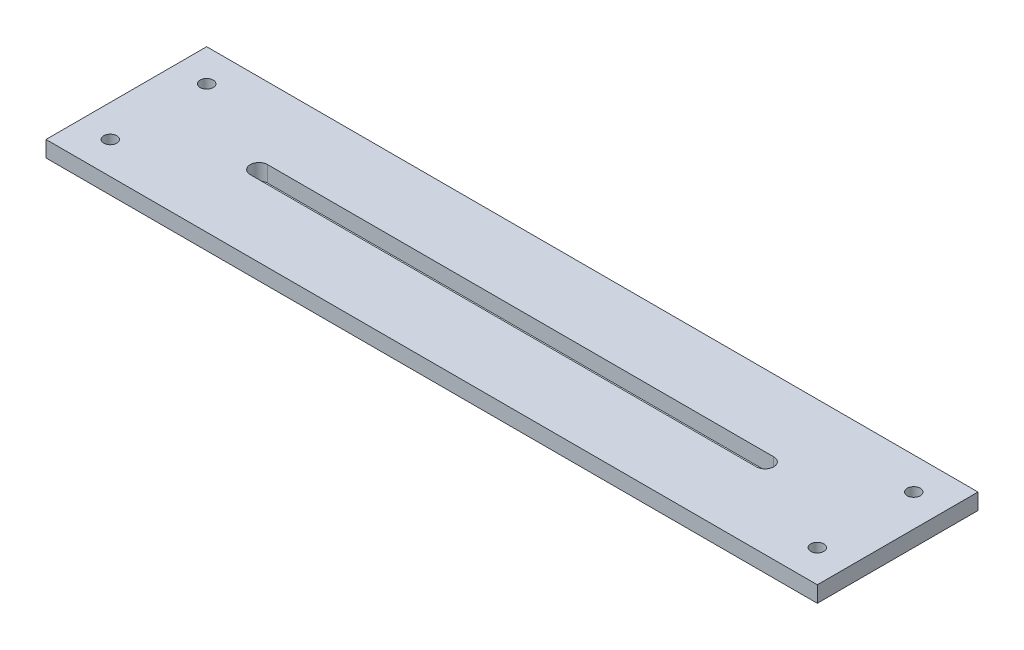
ISO-10303-21;
HEADER;
FILE_DESCRIPTION(('STEP AP214'),'2;1');
FILE_NAME('part.step','',(''),(''),'','','');
FILE_SCHEMA(('AUTOMOTIVE_DESIGN { 1 0 10303 214 1 1 1 1 }'));
ENDSEC;
DATA;
#1=APPLICATION_CONTEXT('core data for automotive mechanical design processes');
#2=APPLICATION_PROTOCOL_DEFINITION('international standard','automotive_design',2000,#1);
#3=PRODUCT_CONTEXT('',#1,'mechanical');
#4=PRODUCT('Part','Part','',(#3));
#5=PRODUCT_RELATED_PRODUCT_CATEGORY('part','',(#4));
#6=PRODUCT_DEFINITION_FORMATION('','',#4);
#7=PRODUCT_DEFINITION_CONTEXT('part definition',#1,'design');
#8=PRODUCT_DEFINITION('design','',#6,#7);
#9=PRODUCT_DEFINITION_SHAPE('','',#8);
#10=(LENGTH_UNIT() NAMED_UNIT(*) SI_UNIT(.MILLI.,.METRE.));
#11=(NAMED_UNIT(*) PLANE_ANGLE_UNIT() SI_UNIT($,.RADIAN.));
#12=(NAMED_UNIT(*) SI_UNIT($,.STERADIAN.) SOLID_ANGLE_UNIT());
#13=UNCERTAINTY_MEASURE_WITH_UNIT(LENGTH_MEASURE(1.E-05),#10,'distance_accuracy_value','');
#14=(GEOMETRIC_REPRESENTATION_CONTEXT(3) GLOBAL_UNCERTAINTY_ASSIGNED_CONTEXT((#13)) GLOBAL_UNIT_ASSIGNED_CONTEXT((#10,
#11,#12)) REPRESENTATION_CONTEXT('',''));
#15=CARTESIAN_POINT('',(0.,0.,0.));
#16=DIRECTION('',(0.,0.,1.));
#17=DIRECTION('',(1.,0.,0.));
#18=AXIS2_PLACEMENT_3D('',#15,#16,#17);
#19=CARTESIAN_POINT('',(0.,6.35,0.));
#20=DIRECTION('',(0.,-1.,0.));
#21=DIRECTION('',(0.,0.,-1.));
#22=AXIS2_PLACEMENT_3D('',#19,#20,#21);
#23=PLANE('',#22);
#24=DIRECTION('',(0.,0.,1.));
#25=VECTOR('',#24,1.);
#26=CARTESIAN_POINT('',(-152.4,6.35,-31.75));
#27=LINE('',#26,#25);
#28=CARTESIAN_POINT('',(-152.4,6.35,-31.75));
#29=VERTEX_POINT('',#28);
#30=CARTESIAN_POINT('',(-152.4,6.35,31.75));
#31=VERTEX_POINT('',#30);
#32=EDGE_CURVE('E137',#29,#31,#27,.T.);
#33=ORIENTED_EDGE('',*,*,#32,.T.);
#34=DIRECTION('',(1.,0.,0.));
#35=VECTOR('',#34,1.);
#36=CARTESIAN_POINT('',(152.4,6.35,31.75));
#37=LINE('',#36,#35);
#38=CARTESIAN_POINT('',(152.4,6.35,31.75));
#39=VERTEX_POINT('',#38);
#40=EDGE_CURVE('E140',#31,#39,#37,.T.);
#41=ORIENTED_EDGE('',*,*,#40,.T.);
#42=DIRECTION('',(0.,0.,-1.));
#43=VECTOR('',#42,1.);
#44=CARTESIAN_POINT('',(152.4,6.35,-31.75));
#45=LINE('',#44,#43);
#46=CARTESIAN_POINT('',(152.4,6.35,-31.75));
#47=VERTEX_POINT('',#46);
#48=EDGE_CURVE('E143',#39,#47,#45,.T.);
#49=ORIENTED_EDGE('',*,*,#48,.T.);
#50=DIRECTION('',(-1.,0.,0.));
#51=VECTOR('',#50,1.);
#52=CARTESIAN_POINT('',(152.4,6.35,-31.75));
#53=LINE('',#52,#51);
#54=EDGE_CURVE('E145',#47,#29,#53,.T.);
#55=ORIENTED_EDGE('',*,*,#54,.T.);
#56=EDGE_LOOP('',(#33,#41,#49,#55));
#57=FACE_BOUND('',#56,.T.);
#58=CARTESIAN_POINT('',(-100.,6.35,0.));
#59=DIRECTION('',(0.,1.,0.));
#60=DIRECTION('',(0.,0.,1.));
#61=AXIS2_PLACEMENT_3D('',#58,#59,#60);
#62=CIRCLE('',#61,3.429);
#63=CARTESIAN_POINT('',(-100.,6.35,-3.429));
#64=VERTEX_POINT('',#63);
#65=CARTESIAN_POINT('',(-100.,6.35,3.429));
#66=VERTEX_POINT('',#65);
#67=EDGE_CURVE('E98',#64,#66,#62,.T.);
#68=ORIENTED_EDGE('',*,*,#67,.F.);
#69=DIRECTION('',(-1.,0.,0.));
#70=VECTOR('',#69,1.);
#71=CARTESIAN_POINT('',(-100.,6.35,-3.429));
#72=LINE('',#71,#70);
#73=CARTESIAN_POINT('',(100.,6.35,-3.429));
#74=VERTEX_POINT('',#73);
#75=EDGE_CURVE('E121',#74,#64,#72,.T.);
#76=ORIENTED_EDGE('',*,*,#75,.F.);
#77=CARTESIAN_POINT('',(100.,6.35,0.));
#78=DIRECTION('',(0.,1.,0.));
#79=DIRECTION('',(0.,0.,1.));
#80=AXIS2_PLACEMENT_3D('',#77,#78,#79);
#81=CIRCLE('',#80,3.429);
#82=CARTESIAN_POINT('',(100.,6.35,3.42899999999996));
#83=VERTEX_POINT('',#82);
#84=EDGE_CURVE('E119',#83,#74,#81,.T.);
#85=ORIENTED_EDGE('',*,*,#84,.F.);
#86=DIRECTION('',(1.,0.,0.));
#87=VECTOR('',#86,1.);
#88=CARTESIAN_POINT('',(-100.,6.35,3.429));
#89=LINE('',#88,#87);
#90=EDGE_CURVE('E106',#66,#83,#89,.T.);
#91=ORIENTED_EDGE('',*,*,#90,.F.);
#92=EDGE_LOOP('',(#68,#76,#85,#91));
#93=FACE_BOUND('',#92,.T.);
#94=CARTESIAN_POINT('',(-139.7,6.35,-19.05));
#95=DIRECTION('',(0.,1.,0.));
#96=DIRECTION('',(0.,0.,1.));
#97=AXIS2_PLACEMENT_3D('',#94,#95,#96);
#98=CIRCLE('',#97,2.57968750000001);
#99=CARTESIAN_POINT('',(-139.7,6.35,-16.4703125));
#100=VERTEX_POINT('',#99);
#101=EDGE_CURVE('E127',#100,#100,#98,.T.);
#102=ORIENTED_EDGE('',*,*,#101,.F.);
#103=EDGE_LOOP('',(#102));
#104=FACE_BOUND('',#103,.T.);
#105=CARTESIAN_POINT('',(139.7,6.35,-19.0499999999993));
#106=DIRECTION('',(0.,1.,0.));
#107=DIRECTION('',(0.,0.,-1.));
#108=AXIS2_PLACEMENT_3D('',#105,#106,#107);
#109=CIRCLE('',#108,2.57968750000002);
#110=CARTESIAN_POINT('',(139.7,6.35,-21.6296874999993));
#111=VERTEX_POINT('',#110);
#112=EDGE_CURVE('E249',#111,#111,#109,.T.);
#113=ORIENTED_EDGE('',*,*,#112,.F.);
#114=EDGE_LOOP('',(#113));
#115=FACE_BOUND('',#114,.T.);
#116=CARTESIAN_POINT('',(139.7,6.35,19.049999999999));
#117=DIRECTION('',(0.,1.,0.));
#118=DIRECTION('',(0.,0.,1.));
#119=AXIS2_PLACEMENT_3D('',#116,#117,#118);
#120=CIRCLE('',#119,2.57968750000002);
#121=CARTESIAN_POINT('',(139.7,6.35,21.6296874999991));
#122=VERTEX_POINT('',#121);
#123=EDGE_CURVE('E243',#122,#122,#120,.T.);
#124=ORIENTED_EDGE('',*,*,#123,.F.);
#125=EDGE_LOOP('',(#124));
#126=FACE_BOUND('',#125,.T.);
#127=CARTESIAN_POINT('',(-139.7,6.35,19.05));
#128=DIRECTION('',(0.,1.,0.));
#129=DIRECTION('',(0.,0.,-1.));
#130=AXIS2_PLACEMENT_3D('',#127,#128,#129);
#131=CIRCLE('',#130,2.57968750000001);
#132=CARTESIAN_POINT('',(-139.7,6.35,16.4703125));
#133=VERTEX_POINT('',#132);
#134=EDGE_CURVE('E234',#133,#133,#131,.T.);
#135=ORIENTED_EDGE('',*,*,#134,.F.);
#136=EDGE_LOOP('',(#135));
#137=FACE_BOUND('',#136,.T.);
#138=ADVANCED_FACE('F33',(#57,#93,#104,#115,#126,#137),#23,.F.);
#139=CARTESIAN_POINT('',(0.,0.,0.));
#140=DIRECTION('',(0.,-1.,0.));
#141=DIRECTION('',(0.,0.,-1.));
#142=AXIS2_PLACEMENT_3D('',#139,#140,#141);
#143=PLANE('',#142);
#144=CARTESIAN_POINT('',(139.7,0.,19.049999999999));
#145=DIRECTION('',(0.,1.,0.));
#146=DIRECTION('',(0.,0.,1.));
#147=AXIS2_PLACEMENT_3D('',#144,#145,#146);
#148=CIRCLE('',#147,2.57968750000002);
#149=CARTESIAN_POINT('',(139.7,0.,21.6296874999991));
#150=VERTEX_POINT('',#149);
#151=EDGE_CURVE('E240',#150,#150,#148,.T.);
#152=ORIENTED_EDGE('',*,*,#151,.T.);
#153=EDGE_LOOP('',(#152));
#154=FACE_BOUND('',#153,.T.);
#155=CARTESIAN_POINT('',(-139.7,0.,-19.05));
#156=DIRECTION('',(0.,1.,0.));
#157=DIRECTION('',(0.,0.,1.));
#158=AXIS2_PLACEMENT_3D('',#155,#156,#157);
#159=CIRCLE('',#158,2.57968750000001);
#160=CARTESIAN_POINT('',(-139.7,0.,-16.4703125));
#161=VERTEX_POINT('',#160);
#162=EDGE_CURVE('E252',#161,#161,#159,.T.);
#163=ORIENTED_EDGE('',*,*,#162,.T.);
#164=EDGE_LOOP('',(#163));
#165=FACE_BOUND('',#164,.T.);
#166=DIRECTION('',(0.,0.,1.));
#167=VECTOR('',#166,1.);
#168=CARTESIAN_POINT('',(-152.4,0.,-31.75));
#169=LINE('',#168,#167);
#170=CARTESIAN_POINT('',(-152.4,0.,-31.75));
#171=VERTEX_POINT('',#170);
#172=CARTESIAN_POINT('',(-152.4,0.,31.75));
#173=VERTEX_POINT('',#172);
#174=EDGE_CURVE('E114',#171,#173,#169,.T.);
#175=ORIENTED_EDGE('',*,*,#174,.F.);
#176=DIRECTION('',(-1.,0.,0.));
#177=VECTOR('',#176,1.);
#178=CARTESIAN_POINT('',(152.4,0.,-31.75));
#179=LINE('',#178,#177);
#180=CARTESIAN_POINT('',(152.4,0.,-31.75));
#181=VERTEX_POINT('',#180);
#182=EDGE_CURVE('E141',#181,#171,#179,.T.);
#183=ORIENTED_EDGE('',*,*,#182,.F.);
#184=DIRECTION('',(0.,0.,-1.));
#185=VECTOR('',#184,1.);
#186=CARTESIAN_POINT('',(152.4,0.,-31.75));
#187=LINE('',#186,#185);
#188=CARTESIAN_POINT('',(152.4,0.,31.75));
#189=VERTEX_POINT('',#188);
#190=EDGE_CURVE('E152',#189,#181,#187,.T.);
#191=ORIENTED_EDGE('',*,*,#190,.F.);
#192=DIRECTION('',(1.,0.,0.));
#193=VECTOR('',#192,1.);
#194=CARTESIAN_POINT('',(152.4,0.,31.75));
#195=LINE('',#194,#193);
#196=EDGE_CURVE('E150',#173,#189,#195,.T.);
#197=ORIENTED_EDGE('',*,*,#196,.F.);
#198=EDGE_LOOP('',(#175,#183,#191,#197));
#199=FACE_BOUND('',#198,.T.);
#200=DIRECTION('',(-1.,0.,0.));
#201=VECTOR('',#200,1.);
#202=CARTESIAN_POINT('',(-100.,0.,-3.429));
#203=LINE('',#202,#201);
#204=CARTESIAN_POINT('',(100.,0.,-3.429));
#205=VERTEX_POINT('',#204);
#206=CARTESIAN_POINT('',(-100.,0.,-3.429));
#207=VERTEX_POINT('',#206);
#208=EDGE_CURVE('E107',#205,#207,#203,.T.);
#209=ORIENTED_EDGE('',*,*,#208,.T.);
#210=CARTESIAN_POINT('',(-100.,0.,0.));
#211=DIRECTION('',(0.,1.,0.));
#212=DIRECTION('',(0.,0.,1.));
#213=AXIS2_PLACEMENT_3D('',#210,#211,#212);
#214=CIRCLE('',#213,3.429);
#215=CARTESIAN_POINT('',(-100.,0.,3.429));
#216=VERTEX_POINT('',#215);
#217=EDGE_CURVE('E56',#207,#216,#214,.T.);
#218=ORIENTED_EDGE('',*,*,#217,.T.);
#219=DIRECTION('',(1.,0.,0.));
#220=VECTOR('',#219,1.);
#221=CARTESIAN_POINT('',(-100.,0.,3.429));
#222=LINE('',#221,#220);
#223=CARTESIAN_POINT('',(100.,0.,3.42899999999996));
#224=VERTEX_POINT('',#223);
#225=EDGE_CURVE('E113',#216,#224,#222,.T.);
#226=ORIENTED_EDGE('',*,*,#225,.T.);
#227=CARTESIAN_POINT('',(100.,0.,0.));
#228=DIRECTION('',(0.,1.,0.));
#229=DIRECTION('',(0.,0.,1.));
#230=AXIS2_PLACEMENT_3D('',#227,#228,#229);
#231=CIRCLE('',#230,3.429);
#232=EDGE_CURVE('E129',#224,#205,#231,.T.);
#233=ORIENTED_EDGE('',*,*,#232,.T.);
#234=EDGE_LOOP('',(#209,#218,#226,#233));
#235=FACE_BOUND('',#234,.T.);
#236=CARTESIAN_POINT('',(139.7,0.,-19.0499999999993));
#237=DIRECTION('',(0.,1.,0.));
#238=DIRECTION('',(0.,0.,-1.));
#239=AXIS2_PLACEMENT_3D('',#236,#237,#238);
#240=CIRCLE('',#239,2.57968750000002);
#241=CARTESIAN_POINT('',(139.7,0.,-21.6296874999993));
#242=VERTEX_POINT('',#241);
#243=EDGE_CURVE('E246',#242,#242,#240,.T.);
#244=ORIENTED_EDGE('',*,*,#243,.T.);
#245=EDGE_LOOP('',(#244));
#246=FACE_BOUND('',#245,.T.);
#247=CARTESIAN_POINT('',(-139.7,0.,19.05));
#248=DIRECTION('',(0.,1.,0.));
#249=DIRECTION('',(0.,0.,-1.));
#250=AXIS2_PLACEMENT_3D('',#247,#248,#249);
#251=CIRCLE('',#250,2.57968750000001);
#252=CARTESIAN_POINT('',(-139.7,0.,16.4703125));
#253=VERTEX_POINT('',#252);
#254=EDGE_CURVE('E237',#253,#253,#251,.T.);
#255=ORIENTED_EDGE('',*,*,#254,.T.);
#256=EDGE_LOOP('',(#255));
#257=FACE_BOUND('',#256,.T.);
#258=ADVANCED_FACE('F170',(#154,#165,#199,#235,#246,#257),#143,.T.);
#259=CARTESIAN_POINT('',(-152.4,6.35,-31.75));
#260=DIRECTION('',(1.,0.,0.));
#261=DIRECTION('',(0.,0.,-1.));
#262=AXIS2_PLACEMENT_3D('',#259,#260,#261);
#263=PLANE('',#262);
#264=ORIENTED_EDGE('',*,*,#174,.T.);
#265=DIRECTION('',(0.,-1.,0.));
#266=VECTOR('',#265,1.);
#267=CARTESIAN_POINT('',(-152.4,6.35,31.75));
#268=LINE('',#267,#266);
#269=EDGE_CURVE('E11',#31,#173,#268,.T.);
#270=ORIENTED_EDGE('',*,*,#269,.F.);
#271=ORIENTED_EDGE('',*,*,#32,.F.);
#272=DIRECTION('',(0.,-1.,0.));
#273=VECTOR('',#272,1.);
#274=CARTESIAN_POINT('',(-152.4,6.35,-31.75));
#275=LINE('',#274,#273);
#276=EDGE_CURVE('E147',#29,#171,#275,.T.);
#277=ORIENTED_EDGE('',*,*,#276,.T.);
#278=EDGE_LOOP('',(#264,#270,#271,#277));
#279=FACE_BOUND('',#278,.T.);
#280=ADVANCED_FACE('F35',(#279),#263,.F.);
#281=CARTESIAN_POINT('',(152.4,6.35,31.75));
#282=DIRECTION('',(0.,0.,-1.));
#283=DIRECTION('',(-1.,0.,0.));
#284=AXIS2_PLACEMENT_3D('',#281,#282,#283);
#285=PLANE('',#284);
#286=ORIENTED_EDGE('',*,*,#196,.T.);
#287=DIRECTION('',(0.,-1.,0.));
#288=VECTOR('',#287,1.);
#289=CARTESIAN_POINT('',(152.4,6.35,31.75));
#290=LINE('',#289,#288);
#291=EDGE_CURVE('E41',#39,#189,#290,.T.);
#292=ORIENTED_EDGE('',*,*,#291,.F.);
#293=ORIENTED_EDGE('',*,*,#40,.F.);
#294=ORIENTED_EDGE('',*,*,#269,.T.);
#295=EDGE_LOOP('',(#286,#292,#293,#294));
#296=FACE_BOUND('',#295,.T.);
#297=ADVANCED_FACE('F180',(#296),#285,.F.);
#298=CARTESIAN_POINT('',(152.4,6.35,-31.75));
#299=DIRECTION('',(-1.,0.,0.));
#300=DIRECTION('',(0.,0.,1.));
#301=AXIS2_PLACEMENT_3D('',#298,#299,#300);
#302=PLANE('',#301);
#303=ORIENTED_EDGE('',*,*,#190,.T.);
#304=DIRECTION('',(0.,-1.,0.));
#305=VECTOR('',#304,1.);
#306=CARTESIAN_POINT('',(152.4,6.35,-31.75));
#307=LINE('',#306,#305);
#308=EDGE_CURVE('E157',#47,#181,#307,.T.);
#309=ORIENTED_EDGE('',*,*,#308,.F.);
#310=ORIENTED_EDGE('',*,*,#48,.F.);
#311=ORIENTED_EDGE('',*,*,#291,.T.);
#312=EDGE_LOOP('',(#303,#309,#310,#311));
#313=FACE_BOUND('',#312,.T.);
#314=ADVANCED_FACE('F164',(#313),#302,.F.);
#315=CARTESIAN_POINT('',(152.4,6.35,-31.75));
#316=DIRECTION('',(0.,0.,1.));
#317=DIRECTION('',(1.,0.,0.));
#318=AXIS2_PLACEMENT_3D('',#315,#316,#317);
#319=PLANE('',#318);
#320=ORIENTED_EDGE('',*,*,#182,.T.);
#321=ORIENTED_EDGE('',*,*,#276,.F.);
#322=ORIENTED_EDGE('',*,*,#54,.F.);
#323=ORIENTED_EDGE('',*,*,#308,.T.);
#324=EDGE_LOOP('',(#320,#321,#322,#323));
#325=FACE_BOUND('',#324,.T.);
#326=ADVANCED_FACE('F174',(#325),#319,.F.);
#327=CARTESIAN_POINT('',(-100.,6.35,0.));
#328=DIRECTION('',(0.,-1.,0.));
#329=DIRECTION('',(0.,0.,-1.));
#330=AXIS2_PLACEMENT_3D('',#327,#328,#329);
#331=CYLINDRICAL_SURFACE('',#330,3.429);
#332=ORIENTED_EDGE('',*,*,#217,.F.);
#333=DIRECTION('',(0.,-1.,0.));
#334=VECTOR('',#333,1.);
#335=CARTESIAN_POINT('',(-100.,6.35,-3.429));
#336=LINE('',#335,#334);
#337=EDGE_CURVE('E102',#64,#207,#336,.T.);
#338=ORIENTED_EDGE('',*,*,#337,.F.);
#339=ORIENTED_EDGE('',*,*,#67,.T.);
#340=DIRECTION('',(0.,-1.,0.));
#341=VECTOR('',#340,1.);
#342=CARTESIAN_POINT('',(-100.,6.35,3.429));
#343=LINE('',#342,#341);
#344=EDGE_CURVE('E101',#66,#216,#343,.T.);
#345=ORIENTED_EDGE('',*,*,#344,.T.);
#346=EDGE_LOOP('',(#332,#338,#339,#345));
#347=FACE_BOUND('',#346,.T.);
#348=ADVANCED_FACE('F100',(#347),#331,.F.);
#349=CARTESIAN_POINT('',(-100.,6.35,3.429));
#350=DIRECTION('',(0.,0.,-1.));
#351=DIRECTION('',(-1.,0.,0.));
#352=AXIS2_PLACEMENT_3D('',#349,#350,#351);
#353=PLANE('',#352);
#354=ORIENTED_EDGE('',*,*,#225,.F.);
#355=ORIENTED_EDGE('',*,*,#344,.F.);
#356=ORIENTED_EDGE('',*,*,#90,.T.);
#357=DIRECTION('',(0.,-1.,0.));
#358=VECTOR('',#357,1.);
#359=CARTESIAN_POINT('',(100.,6.35,3.42899999999996));
#360=LINE('',#359,#358);
#361=EDGE_CURVE('E115',#83,#224,#360,.T.);
#362=ORIENTED_EDGE('',*,*,#361,.T.);
#363=EDGE_LOOP('',(#354,#355,#356,#362));
#364=FACE_BOUND('',#363,.T.);
#365=ADVANCED_FACE('F110',(#364),#353,.T.);
#366=CARTESIAN_POINT('',(100.,6.35,0.));
#367=DIRECTION('',(0.,-1.,0.));
#368=DIRECTION('',(0.,0.,-1.));
#369=AXIS2_PLACEMENT_3D('',#366,#367,#368);
#370=CYLINDRICAL_SURFACE('',#369,3.429);
#371=ORIENTED_EDGE('',*,*,#232,.F.);
#372=ORIENTED_EDGE('',*,*,#361,.F.);
#373=ORIENTED_EDGE('',*,*,#84,.T.);
#374=DIRECTION('',(0.,-1.,0.));
#375=VECTOR('',#374,1.);
#376=CARTESIAN_POINT('',(100.,6.35,-3.429));
#377=LINE('',#376,#375);
#378=EDGE_CURVE('E48',#74,#205,#377,.T.);
#379=ORIENTED_EDGE('',*,*,#378,.T.);
#380=EDGE_LOOP('',(#371,#372,#373,#379));
#381=FACE_BOUND('',#380,.T.);
#382=ADVANCED_FACE('F204',(#381),#370,.F.);
#383=CARTESIAN_POINT('',(-100.,6.35,-3.429));
#384=DIRECTION('',(0.,0.,1.));
#385=DIRECTION('',(1.,0.,0.));
#386=AXIS2_PLACEMENT_3D('',#383,#384,#385);
#387=PLANE('',#386);
#388=ORIENTED_EDGE('',*,*,#208,.F.);
#389=ORIENTED_EDGE('',*,*,#378,.F.);
#390=ORIENTED_EDGE('',*,*,#75,.T.);
#391=ORIENTED_EDGE('',*,*,#337,.T.);
#392=EDGE_LOOP('',(#388,#389,#390,#391));
#393=FACE_BOUND('',#392,.T.);
#394=ADVANCED_FACE('F208',(#393),#387,.T.);
#395=CARTESIAN_POINT('',(-139.7,6.35,-19.05));
#396=DIRECTION('',(0.,-1.,0.));
#397=DIRECTION('',(0.,0.,-1.));
#398=AXIS2_PLACEMENT_3D('',#395,#396,#397);
#399=CYLINDRICAL_SURFACE('',#398,2.57968750000001);
#400=ORIENTED_EDGE('',*,*,#101,.T.);
#401=EDGE_LOOP('',(#400));
#402=FACE_BOUND('',#401,.T.);
#403=ORIENTED_EDGE('',*,*,#162,.F.);
#404=EDGE_LOOP('',(#403));
#405=FACE_BOUND('',#404,.T.);
#406=ADVANCED_FACE('F214',(#402,#405),#399,.F.);
#407=CARTESIAN_POINT('',(139.7,6.35,-19.0499999999993));
#408=DIRECTION('',(0.,-1.,0.));
#409=DIRECTION('',(0.,0.,-1.));
#410=AXIS2_PLACEMENT_3D('',#407,#408,#409);
#411=CYLINDRICAL_SURFACE('',#410,2.57968750000002);
#412=ORIENTED_EDGE('',*,*,#112,.T.);
#413=EDGE_LOOP('',(#412));
#414=FACE_BOUND('',#413,.T.);
#415=ORIENTED_EDGE('',*,*,#243,.F.);
#416=EDGE_LOOP('',(#415));
#417=FACE_BOUND('',#416,.T.);
#418=ADVANCED_FACE('F217',(#414,#417),#411,.F.);
#419=CARTESIAN_POINT('',(139.7,6.35,19.049999999999));
#420=DIRECTION('',(0.,-1.,0.));
#421=DIRECTION('',(0.,0.,-1.));
#422=AXIS2_PLACEMENT_3D('',#419,#420,#421);
#423=CYLINDRICAL_SURFACE('',#422,2.57968750000002);
#424=ORIENTED_EDGE('',*,*,#123,.T.);
#425=EDGE_LOOP('',(#424));
#426=FACE_BOUND('',#425,.T.);
#427=ORIENTED_EDGE('',*,*,#151,.F.);
#428=EDGE_LOOP('',(#427));
#429=FACE_BOUND('',#428,.T.);
#430=ADVANCED_FACE('F221',(#426,#429),#423,.F.);
#431=CARTESIAN_POINT('',(-139.7,6.35,19.05));
#432=DIRECTION('',(0.,-1.,0.));
#433=DIRECTION('',(0.,0.,-1.));
#434=AXIS2_PLACEMENT_3D('',#431,#432,#433);
#435=CYLINDRICAL_SURFACE('',#434,2.57968750000001);
#436=ORIENTED_EDGE('',*,*,#134,.T.);
#437=EDGE_LOOP('',(#436));
#438=FACE_BOUND('',#437,.T.);
#439=ORIENTED_EDGE('',*,*,#254,.F.);
#440=EDGE_LOOP('',(#439));
#441=FACE_BOUND('',#440,.T.);
#442=ADVANCED_FACE('F225',(#438,#441),#435,.F.);
#443=CLOSED_SHELL('',(#138,#258,#280,#297,#314,#326,#348,#365,#382,#394,#406,#418,#430,#442));
#444=MANIFOLD_SOLID_BREP('B2',#443);
#445=ADVANCED_BREP_SHAPE_REPRESENTATION('',(#18,#444),#14);
#446=SHAPE_DEFINITION_REPRESENTATION(#9,#445);
ENDSEC;
END-ISO-10303-21;
